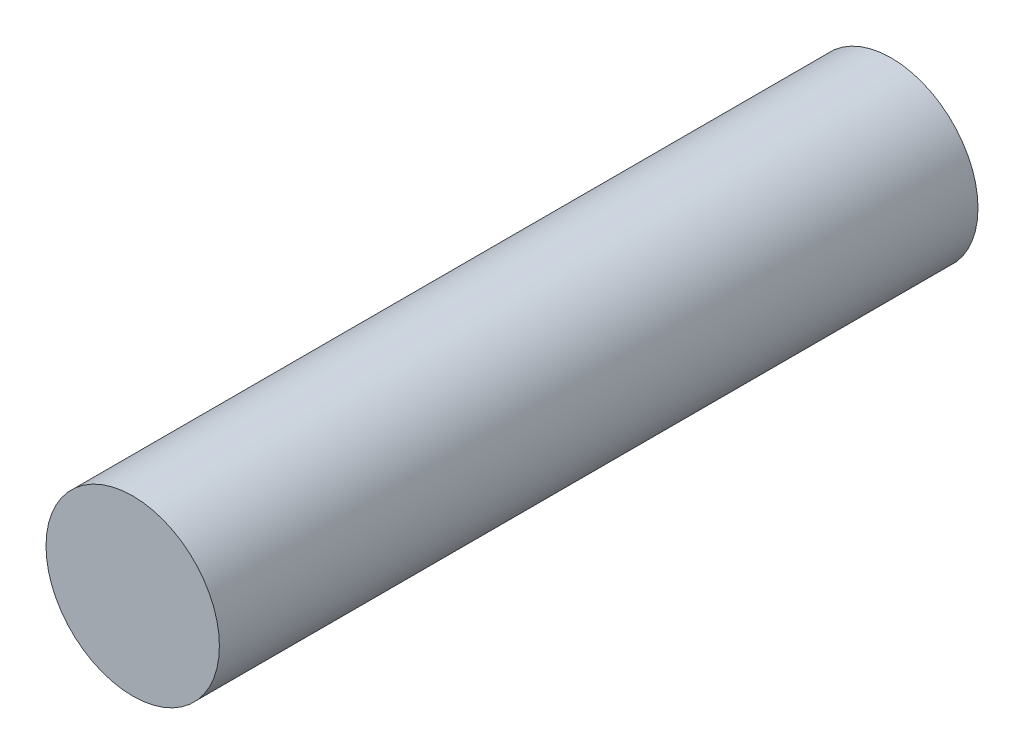
ISO-10303-21;
HEADER;
FILE_DESCRIPTION(('STEP AP214'),'2;1');
FILE_NAME('part.step','',(''),(''),'','','');
FILE_SCHEMA(('AUTOMOTIVE_DESIGN { 1 0 10303 214 1 1 1 1 }'));
ENDSEC;
DATA;
#1=APPLICATION_CONTEXT('core data for automotive mechanical design processes');
#2=APPLICATION_PROTOCOL_DEFINITION('international standard','automotive_design',2000,#1);
#3=PRODUCT_CONTEXT('',#1,'mechanical');
#4=PRODUCT('Part','Part','',(#3));
#5=PRODUCT_RELATED_PRODUCT_CATEGORY('part','',(#4));
#6=PRODUCT_DEFINITION_FORMATION('','',#4);
#7=PRODUCT_DEFINITION_CONTEXT('part definition',#1,'design');
#8=PRODUCT_DEFINITION('design','',#6,#7);
#9=PRODUCT_DEFINITION_SHAPE('','',#8);
#10=(LENGTH_UNIT() NAMED_UNIT(*) SI_UNIT(.MILLI.,.METRE.));
#11=(NAMED_UNIT(*) PLANE_ANGLE_UNIT() SI_UNIT($,.RADIAN.));
#12=(NAMED_UNIT(*) SI_UNIT($,.STERADIAN.) SOLID_ANGLE_UNIT());
#13=UNCERTAINTY_MEASURE_WITH_UNIT(LENGTH_MEASURE(1.E-05),#10,'distance_accuracy_value','');
#14=(GEOMETRIC_REPRESENTATION_CONTEXT(3) GLOBAL_UNCERTAINTY_ASSIGNED_CONTEXT((#13)) GLOBAL_UNIT_ASSIGNED_CONTEXT((#10,
#11,#12)) REPRESENTATION_CONTEXT('',''));
#15=CARTESIAN_POINT('',(0.,0.,0.));
#16=DIRECTION('',(0.,0.,1.));
#17=DIRECTION('',(1.,0.,0.));
#18=AXIS2_PLACEMENT_3D('',#15,#16,#17);
#19=CARTESIAN_POINT('',(0.,0.,35.));
#20=DIRECTION('',(0.,0.,-1.));
#21=DIRECTION('',(-1.,0.,0.));
#22=AXIS2_PLACEMENT_3D('',#19,#20,#21);
#23=CYLINDRICAL_SURFACE('',#22,4.);
#24=CARTESIAN_POINT('',(0.,0.,35.));
#25=DIRECTION('',(0.,0.,1.));
#26=DIRECTION('',(1.,0.,0.));
#27=AXIS2_PLACEMENT_3D('',#24,#25,#26);
#28=CIRCLE('',#27,4.);
#29=CARTESIAN_POINT('',(4.,0.,35.));
#30=VERTEX_POINT('',#29);
#31=EDGE_CURVE('E10',#30,#30,#28,.T.);
#32=ORIENTED_EDGE('',*,*,#31,.F.);
#33=EDGE_LOOP('',(#32));
#34=FACE_BOUND('',#33,.T.);
#35=CARTESIAN_POINT('',(0.,0.,0.));
#36=DIRECTION('',(0.,0.,1.));
#37=DIRECTION('',(1.,0.,0.));
#38=AXIS2_PLACEMENT_3D('',#35,#36,#37);
#39=CIRCLE('',#38,4.);
#40=CARTESIAN_POINT('',(4.,0.,0.));
#41=VERTEX_POINT('',#40);
#42=EDGE_CURVE('E34',#41,#41,#39,.T.);
#43=ORIENTED_EDGE('',*,*,#42,.T.);
#44=EDGE_LOOP('',(#43));
#45=FACE_BOUND('',#44,.T.);
#46=ADVANCED_FACE('F31',(#34,#45),#23,.T.);
#47=CARTESIAN_POINT('',(0.,0.,35.));
#48=DIRECTION('',(0.,0.,1.));
#49=DIRECTION('',(1.,0.,0.));
#50=AXIS2_PLACEMENT_3D('',#47,#48,#49);
#51=PLANE('',#50);
#52=ORIENTED_EDGE('',*,*,#31,.T.);
#53=EDGE_LOOP('',(#52));
#54=FACE_BOUND('',#53,.T.);
#55=ADVANCED_FACE('F46',(#54),#51,.T.);
#56=CARTESIAN_POINT('',(0.,0.,0.));
#57=DIRECTION('',(0.,0.,1.));
#58=DIRECTION('',(1.,0.,0.));
#59=AXIS2_PLACEMENT_3D('',#56,#57,#58);
#60=PLANE('',#59);
#61=ORIENTED_EDGE('',*,*,#42,.F.);
#62=EDGE_LOOP('',(#61));
#63=FACE_BOUND('',#62,.T.);
#64=ADVANCED_FACE('F44',(#63),#60,.F.);
#65=CLOSED_SHELL('',(#46,#55,#64));
#66=MANIFOLD_SOLID_BREP('B2',#65);
#67=ADVANCED_BREP_SHAPE_REPRESENTATION('',(#18,#66),#14);
#68=SHAPE_DEFINITION_REPRESENTATION(#9,#67);
ENDSEC;
END-ISO-10303-21;
